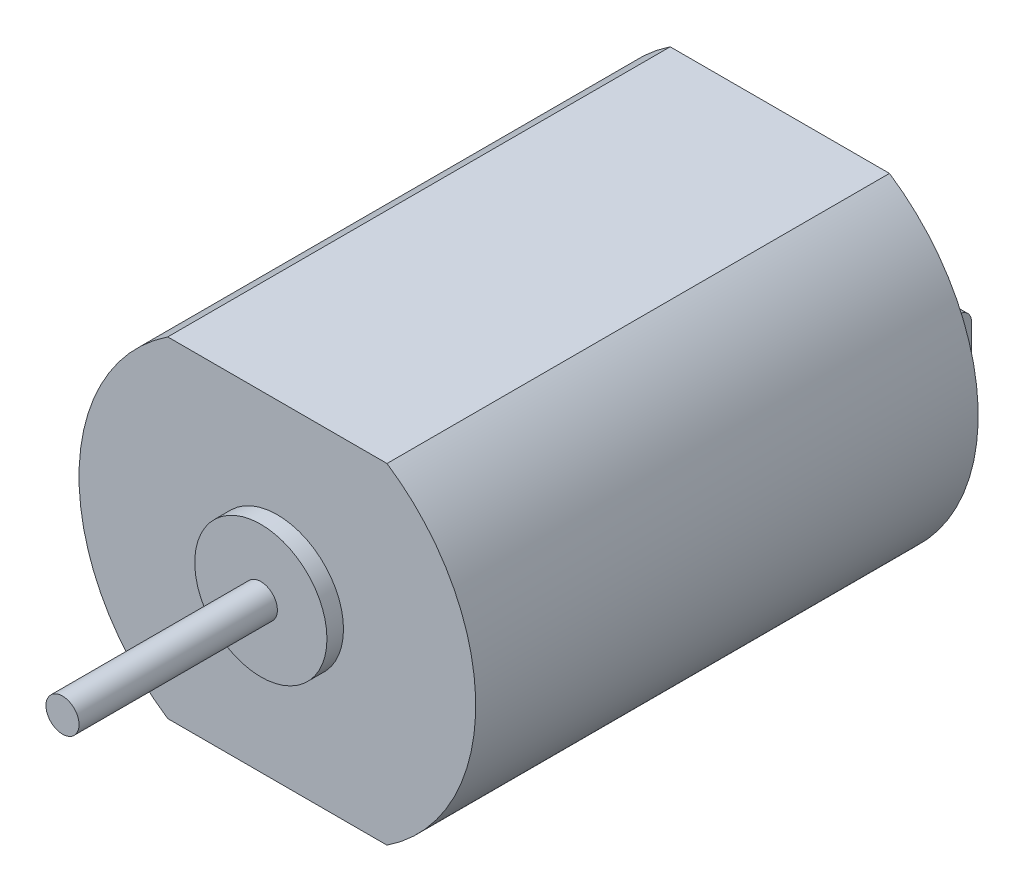
ISO-10303-21;
HEADER;
FILE_DESCRIPTION(('STEP AP214'),'2;1');
FILE_NAME('part.step','',(''),(''),'','','');
FILE_SCHEMA(('AUTOMOTIVE_DESIGN { 1 0 10303 214 1 1 1 1 }'));
ENDSEC;
DATA;
#1=APPLICATION_CONTEXT('core data for automotive mechanical design processes');
#2=APPLICATION_PROTOCOL_DEFINITION('international standard','automotive_design',2000,#1);
#3=PRODUCT_CONTEXT('',#1,'mechanical');
#4=PRODUCT('Part','Part','',(#3));
#5=PRODUCT_RELATED_PRODUCT_CATEGORY('part','',(#4));
#6=PRODUCT_DEFINITION_FORMATION('','',#4);
#7=PRODUCT_DEFINITION_CONTEXT('part definition',#1,'design');
#8=PRODUCT_DEFINITION('design','',#6,#7);
#9=PRODUCT_DEFINITION_SHAPE('','',#8);
#10=(LENGTH_UNIT() NAMED_UNIT(*) SI_UNIT(.MILLI.,.METRE.));
#11=(NAMED_UNIT(*) PLANE_ANGLE_UNIT() SI_UNIT($,.RADIAN.));
#12=(NAMED_UNIT(*) SI_UNIT($,.STERADIAN.) SOLID_ANGLE_UNIT());
#13=UNCERTAINTY_MEASURE_WITH_UNIT(LENGTH_MEASURE(1.E-05),#10,'distance_accuracy_value','');
#14=(GEOMETRIC_REPRESENTATION_CONTEXT(3) GLOBAL_UNCERTAINTY_ASSIGNED_CONTEXT((#13)) GLOBAL_UNIT_ASSIGNED_CONTEXT((#10,
#11,#12)) REPRESENTATION_CONTEXT('',''));
#15=CARTESIAN_POINT('',(0.,0.,0.));
#16=DIRECTION('',(0.,0.,1.));
#17=DIRECTION('',(1.,0.,0.));
#18=AXIS2_PLACEMENT_3D('',#15,#16,#17);
#19=CARTESIAN_POINT('',(0.,5.,15.2));
#20=DIRECTION('',(0.,1.,0.));
#21=DIRECTION('',(0.,0.,1.));
#22=AXIS2_PLACEMENT_3D('',#19,#20,#21);
#23=PLANE('',#22);
#24=DIRECTION('',(1.,0.,0.));
#25=VECTOR('',#24,1.);
#26=CARTESIAN_POINT('',(0.,5.,0.));
#27=LINE('',#26,#25);
#28=CARTESIAN_POINT('',(-3.3166247903554,5.,0.));
#29=VERTEX_POINT('',#28);
#30=CARTESIAN_POINT('',(3.3166247903554,5.,0.));
#31=VERTEX_POINT('',#30);
#32=EDGE_CURVE('E311',#29,#31,#27,.T.);
#33=ORIENTED_EDGE('',*,*,#32,.F.);
#34=DIRECTION('',(0.,0.,-1.));
#35=VECTOR('',#34,1.);
#36=CARTESIAN_POINT('',(-3.3166247903554,5.,15.2));
#37=LINE('',#36,#35);
#38=CARTESIAN_POINT('',(-3.3166247903554,5.,15.2));
#39=VERTEX_POINT('',#38);
#40=EDGE_CURVE('E340',#39,#29,#37,.T.);
#41=ORIENTED_EDGE('',*,*,#40,.F.);
#42=DIRECTION('',(1.,0.,0.));
#43=VECTOR('',#42,1.);
#44=CARTESIAN_POINT('',(0.,5.,15.2));
#45=LINE('',#44,#43);
#46=CARTESIAN_POINT('',(3.3166247903554,5.,15.2));
#47=VERTEX_POINT('',#46);
#48=EDGE_CURVE('E317',#39,#47,#45,.T.);
#49=ORIENTED_EDGE('',*,*,#48,.T.);
#50=DIRECTION('',(0.,0.,-1.));
#51=VECTOR('',#50,1.);
#52=CARTESIAN_POINT('',(3.3166247903554,5.,15.2));
#53=LINE('',#52,#51);
#54=EDGE_CURVE('E332',#47,#31,#53,.T.);
#55=ORIENTED_EDGE('',*,*,#54,.T.);
#56=EDGE_LOOP('',(#33,#41,#49,#55));
#57=FACE_BOUND('',#56,.T.);
#58=ADVANCED_FACE('F39',(#57),#23,.T.);
#59=CARTESIAN_POINT('',(0.,0.,15.2));
#60=DIRECTION('',(0.,0.,-1.));
#61=DIRECTION('',(-1.,0.,0.));
#62=AXIS2_PLACEMENT_3D('',#59,#60,#61);
#63=CYLINDRICAL_SURFACE('',#62,6.);
#64=CARTESIAN_POINT('',(0.,0.,0.));
#65=DIRECTION('',(0.,0.,1.));
#66=DIRECTION('',(1.,0.,0.));
#67=AXIS2_PLACEMENT_3D('',#64,#65,#66);
#68=CIRCLE('',#67,6.);
#69=CARTESIAN_POINT('',(-3.3166247903554,-5.,0.));
#70=VERTEX_POINT('',#69);
#71=EDGE_CURVE('E328',#29,#70,#68,.T.);
#72=ORIENTED_EDGE('',*,*,#71,.T.);
#73=DIRECTION('',(0.,0.,-1.));
#74=VECTOR('',#73,1.);
#75=CARTESIAN_POINT('',(-3.3166247903554,-5.,15.2));
#76=LINE('',#75,#74);
#77=CARTESIAN_POINT('',(-3.3166247903554,-5.,15.2));
#78=VERTEX_POINT('',#77);
#79=EDGE_CURVE('E337',#78,#70,#76,.T.);
#80=ORIENTED_EDGE('',*,*,#79,.F.);
#81=CARTESIAN_POINT('',(0.,0.,15.2));
#82=DIRECTION('',(0.,0.,1.));
#83=DIRECTION('',(1.,0.,0.));
#84=AXIS2_PLACEMENT_3D('',#81,#82,#83);
#85=CIRCLE('',#84,6.);
#86=EDGE_CURVE('E320',#39,#78,#85,.T.);
#87=ORIENTED_EDGE('',*,*,#86,.F.);
#88=ORIENTED_EDGE('',*,*,#40,.T.);
#89=EDGE_LOOP('',(#72,#80,#87,#88));
#90=FACE_BOUND('',#89,.T.);
#91=ADVANCED_FACE('F441',(#90),#63,.T.);
#92=CARTESIAN_POINT('',(0.,-5.,15.2));
#93=DIRECTION('',(0.,1.,0.));
#94=DIRECTION('',(0.,0.,1.));
#95=AXIS2_PLACEMENT_3D('',#92,#93,#94);
#96=PLANE('',#95);
#97=DIRECTION('',(1.,0.,0.));
#98=VECTOR('',#97,1.);
#99=CARTESIAN_POINT('',(0.,-5.,0.));
#100=LINE('',#99,#98);
#101=CARTESIAN_POINT('',(3.3166247903554,-5.,0.));
#102=VERTEX_POINT('',#101);
#103=EDGE_CURVE('E330',#70,#102,#100,.T.);
#104=ORIENTED_EDGE('',*,*,#103,.T.);
#105=DIRECTION('',(0.,0.,-1.));
#106=VECTOR('',#105,1.);
#107=CARTESIAN_POINT('',(3.3166247903554,-5.,15.2));
#108=LINE('',#107,#106);
#109=CARTESIAN_POINT('',(3.3166247903554,-5.,15.2));
#110=VERTEX_POINT('',#109);
#111=EDGE_CURVE('E334',#110,#102,#108,.T.);
#112=ORIENTED_EDGE('',*,*,#111,.F.);
#113=DIRECTION('',(1.,0.,0.));
#114=VECTOR('',#113,1.);
#115=CARTESIAN_POINT('',(0.,-5.,15.2));
#116=LINE('',#115,#114);
#117=EDGE_CURVE('E323',#78,#110,#116,.T.);
#118=ORIENTED_EDGE('',*,*,#117,.F.);
#119=ORIENTED_EDGE('',*,*,#79,.T.);
#120=EDGE_LOOP('',(#104,#112,#118,#119));
#121=FACE_BOUND('',#120,.T.);
#122=ADVANCED_FACE('F447',(#121),#96,.F.);
#123=EDGE_CURVE('E321',#102,#31,#68,.T.);
#124=ORIENTED_EDGE('',*,*,#123,.T.);
#125=ORIENTED_EDGE('',*,*,#54,.F.);
#126=EDGE_CURVE('E324',#110,#47,#85,.T.);
#127=ORIENTED_EDGE('',*,*,#126,.F.);
#128=ORIENTED_EDGE('',*,*,#111,.T.);
#129=EDGE_LOOP('',(#124,#125,#127,#128));
#130=FACE_BOUND('',#129,.T.);
#131=ADVANCED_FACE('F450',(#130),#63,.T.);
#132=CARTESIAN_POINT('',(0.,0.,15.2));
#133=DIRECTION('',(0.,0.,1.));
#134=DIRECTION('',(1.,0.,0.));
#135=AXIS2_PLACEMENT_3D('',#132,#133,#134);
#136=PLANE('',#135);
#137=CARTESIAN_POINT('',(0.,0.,15.2));
#138=DIRECTION('',(0.,0.,1.));
#139=DIRECTION('',(1.,0.,0.));
#140=AXIS2_PLACEMENT_3D('',#137,#138,#139);
#141=CIRCLE('',#140,2.);
#142=CARTESIAN_POINT('',(2.,0.,15.2));
#143=VERTEX_POINT('',#142);
#144=EDGE_CURVE('E11',#143,#143,#141,.T.);
#145=ORIENTED_EDGE('',*,*,#144,.F.);
#146=EDGE_LOOP('',(#145));
#147=FACE_BOUND('',#146,.T.);
#148=ORIENTED_EDGE('',*,*,#48,.F.);
#149=ORIENTED_EDGE('',*,*,#86,.T.);
#150=ORIENTED_EDGE('',*,*,#117,.T.);
#151=ORIENTED_EDGE('',*,*,#126,.T.);
#152=EDGE_LOOP('',(#148,#149,#150,#151));
#153=FACE_BOUND('',#152,.T.);
#154=ADVANCED_FACE('F501',(#147,#153),#136,.T.);
#155=CARTESIAN_POINT('',(0.,0.,0.));
#156=DIRECTION('',(0.,0.,1.));
#157=DIRECTION('',(1.,0.,0.));
#158=AXIS2_PLACEMENT_3D('',#155,#156,#157);
#159=PLANE('',#158);
#160=CARTESIAN_POINT('',(0.,0.,0.));
#161=DIRECTION('',(0.,0.,1.));
#162=DIRECTION('',(1.,0.,0.));
#163=AXIS2_PLACEMENT_3D('',#160,#161,#162);
#164=CIRCLE('',#163,2.5);
#165=CARTESIAN_POINT('',(2.5,0.,0.));
#166=VERTEX_POINT('',#165);
#167=EDGE_CURVE('E406',#166,#166,#164,.T.);
#168=ORIENTED_EDGE('',*,*,#167,.T.);
#169=EDGE_LOOP('',(#168));
#170=FACE_BOUND('',#169,.T.);
#171=DIRECTION('',(0.,1.,0.));
#172=VECTOR('',#171,1.);
#173=CARTESIAN_POINT('',(-3.8,-0.75,0.));
#174=LINE('',#173,#172);
#175=CARTESIAN_POINT('',(-3.8,-0.75,0.));
#176=VERTEX_POINT('',#175);
#177=CARTESIAN_POINT('',(-3.8,0.75,0.));
#178=VERTEX_POINT('',#177);
#179=EDGE_CURVE('E273',#176,#178,#174,.T.);
#180=ORIENTED_EDGE('',*,*,#179,.F.);
#181=DIRECTION('',(1.,0.,0.));
#182=VECTOR('',#181,1.);
#183=CARTESIAN_POINT('',(-3.8,-0.75,0.));
#184=LINE('',#183,#182);
#185=CARTESIAN_POINT('',(-3.5,-0.75,0.));
#186=VERTEX_POINT('',#185);
#187=EDGE_CURVE('E283',#176,#186,#184,.T.);
#188=ORIENTED_EDGE('',*,*,#187,.T.);
#189=DIRECTION('',(0.,1.,0.));
#190=VECTOR('',#189,1.);
#191=CARTESIAN_POINT('',(-3.5,-0.75,0.));
#192=LINE('',#191,#190);
#193=CARTESIAN_POINT('',(-3.5,0.75,0.));
#194=VERTEX_POINT('',#193);
#195=EDGE_CURVE('E280',#186,#194,#192,.T.);
#196=ORIENTED_EDGE('',*,*,#195,.T.);
#197=DIRECTION('',(1.,0.,0.));
#198=VECTOR('',#197,1.);
#199=CARTESIAN_POINT('',(-3.8,0.75,0.));
#200=LINE('',#199,#198);
#201=EDGE_CURVE('E276',#178,#194,#200,.T.);
#202=ORIENTED_EDGE('',*,*,#201,.F.);
#203=EDGE_LOOP('',(#180,#188,#196,#202));
#204=FACE_BOUND('',#203,.T.);
#205=DIRECTION('',(0.,1.,0.));
#206=VECTOR('',#205,1.);
#207=CARTESIAN_POINT('',(3.5,-0.75,0.));
#208=LINE('',#207,#206);
#209=CARTESIAN_POINT('',(3.5,-0.75,0.));
#210=VERTEX_POINT('',#209);
#211=CARTESIAN_POINT('',(3.5,0.75,0.));
#212=VERTEX_POINT('',#211);
#213=EDGE_CURVE('E295',#210,#212,#208,.T.);
#214=ORIENTED_EDGE('',*,*,#213,.F.);
#215=DIRECTION('',(1.,0.,0.));
#216=VECTOR('',#215,1.);
#217=CARTESIAN_POINT('',(3.5,-0.75,0.));
#218=LINE('',#217,#216);
#219=CARTESIAN_POINT('',(3.8,-0.75,0.));
#220=VERTEX_POINT('',#219);
#221=EDGE_CURVE('E286',#210,#220,#218,.T.);
#222=ORIENTED_EDGE('',*,*,#221,.T.);
#223=DIRECTION('',(0.,1.,0.));
#224=VECTOR('',#223,1.);
#225=CARTESIAN_POINT('',(3.8,-0.75,0.));
#226=LINE('',#225,#224);
#227=CARTESIAN_POINT('',(3.8,0.75,0.));
#228=VERTEX_POINT('',#227);
#229=EDGE_CURVE('E301',#220,#228,#226,.T.);
#230=ORIENTED_EDGE('',*,*,#229,.T.);
#231=DIRECTION('',(1.,0.,0.));
#232=VECTOR('',#231,1.);
#233=CARTESIAN_POINT('',(3.5,0.75,0.));
#234=LINE('',#233,#232);
#235=EDGE_CURVE('E304',#212,#228,#234,.T.);
#236=ORIENTED_EDGE('',*,*,#235,.F.);
#237=EDGE_LOOP('',(#214,#222,#230,#236));
#238=FACE_BOUND('',#237,.T.);
#239=ORIENTED_EDGE('',*,*,#32,.T.);
#240=ORIENTED_EDGE('',*,*,#123,.F.);
#241=ORIENTED_EDGE('',*,*,#103,.F.);
#242=ORIENTED_EDGE('',*,*,#71,.F.);
#243=EDGE_LOOP('',(#239,#240,#241,#242));
#244=FACE_BOUND('',#243,.T.);
#245=ADVANCED_FACE('F480',(#170,#204,#238,#244),#159,.F.);
#246=CARTESIAN_POINT('',(3.5,-0.75,-2.));
#247=DIRECTION('',(0.,-1.,0.));
#248=DIRECTION('',(0.,0.,-1.));
#249=AXIS2_PLACEMENT_3D('',#246,#247,#248);
#250=PLANE('',#249);
#251=DIRECTION('',(0.,0.,1.));
#252=VECTOR('',#251,1.);
#253=CARTESIAN_POINT('',(3.5,-0.75,-2.));
#254=LINE('',#253,#252);
#255=CARTESIAN_POINT('',(3.5,-0.75,-1.6));
#256=VERTEX_POINT('',#255);
#257=EDGE_CURVE('E309',#256,#210,#254,.T.);
#258=ORIENTED_EDGE('',*,*,#257,.F.);
#259=DIRECTION('',(1.,0.,0.));
#260=VECTOR('',#259,1.);
#261=CARTESIAN_POINT('',(3.8,-0.75,-1.6));
#262=LINE('',#261,#260);
#263=CARTESIAN_POINT('',(3.8,-0.75,-1.6));
#264=VERTEX_POINT('',#263);
#265=EDGE_CURVE('E382',#256,#264,#262,.T.);
#266=ORIENTED_EDGE('',*,*,#265,.T.);
#267=DIRECTION('',(0.,0.,1.));
#268=VECTOR('',#267,1.);
#269=CARTESIAN_POINT('',(3.8,-0.75,-2.));
#270=LINE('',#269,#268);
#271=EDGE_CURVE('E298',#264,#220,#270,.T.);
#272=ORIENTED_EDGE('',*,*,#271,.T.);
#273=ORIENTED_EDGE('',*,*,#221,.F.);
#274=EDGE_LOOP('',(#258,#266,#272,#273));
#275=FACE_BOUND('',#274,.T.);
#276=ADVANCED_FACE('F473',(#275),#250,.T.);
#277=CARTESIAN_POINT('',(3.5,-0.75,-2.));
#278=DIRECTION('',(1.,0.,0.));
#279=DIRECTION('',(0.,0.,-1.));
#280=AXIS2_PLACEMENT_3D('',#277,#278,#279);
#281=PLANE('',#280);
#282=DIRECTION('',(0.,0.,1.));
#283=VECTOR('',#282,1.);
#284=CARTESIAN_POINT('',(3.5,0.449999999999999,-2.));
#285=LINE('',#284,#283);
#286=CARTESIAN_POINT('',(3.5,0.45,-1.05));
#287=VERTEX_POINT('',#286);
#288=CARTESIAN_POINT('',(3.5,0.45,-0.95));
#289=VERTEX_POINT('',#288);
#290=EDGE_CURVE('E255',#287,#289,#285,.T.);
#291=ORIENTED_EDGE('',*,*,#290,.T.);
#292=CARTESIAN_POINT('',(3.5,0.,-0.95));
#293=DIRECTION('',(1.,0.,0.));
#294=DIRECTION('',(0.,0.,-1.));
#295=AXIS2_PLACEMENT_3D('',#292,#293,#294);
#296=CIRCLE('',#295,0.45);
#297=CARTESIAN_POINT('',(3.5,-0.45,-0.95));
#298=VERTEX_POINT('',#297);
#299=EDGE_CURVE('E261',#289,#298,#296,.T.);
#300=ORIENTED_EDGE('',*,*,#299,.T.);
#301=DIRECTION('',(0.,0.,-1.));
#302=VECTOR('',#301,1.);
#303=CARTESIAN_POINT('',(3.5,-0.45,-2.));
#304=LINE('',#303,#302);
#305=CARTESIAN_POINT('',(3.5,-0.45,-1.05));
#306=VERTEX_POINT('',#305);
#307=EDGE_CURVE('E246',#298,#306,#304,.T.);
#308=ORIENTED_EDGE('',*,*,#307,.T.);
#309=CARTESIAN_POINT('',(3.5,0.,-1.05));
#310=DIRECTION('',(1.,0.,0.));
#311=DIRECTION('',(0.,0.,-1.));
#312=AXIS2_PLACEMENT_3D('',#309,#310,#311);
#313=CIRCLE('',#312,0.45);
#314=EDGE_CURVE('E212',#306,#287,#313,.T.);
#315=ORIENTED_EDGE('',*,*,#314,.T.);
#316=EDGE_LOOP('',(#291,#300,#308,#315));
#317=FACE_BOUND('',#316,.T.);
#318=DIRECTION('',(0.,0.,1.));
#319=VECTOR('',#318,1.);
#320=CARTESIAN_POINT('',(3.5,0.75,-2.));
#321=LINE('',#320,#319);
#322=CARTESIAN_POINT('',(3.5,0.75,-1.6));
#323=VERTEX_POINT('',#322);
#324=EDGE_CURVE('E312',#323,#212,#321,.T.);
#325=ORIENTED_EDGE('',*,*,#324,.F.);
#326=CARTESIAN_POINT('',(3.5,0.35,-1.6));
#327=DIRECTION('',(1.,0.,0.));
#328=DIRECTION('',(0.,0.,-1.));
#329=AXIS2_PLACEMENT_3D('',#326,#327,#328);
#330=CIRCLE('',#329,0.4);
#331=CARTESIAN_POINT('',(3.5,0.35,-2.));
#332=VERTEX_POINT('',#331);
#333=EDGE_CURVE('E380',#323,#332,#330,.F.);
#334=ORIENTED_EDGE('',*,*,#333,.T.);
#335=DIRECTION('',(0.,1.,0.));
#336=VECTOR('',#335,1.);
#337=CARTESIAN_POINT('',(3.5,-0.75,-2.));
#338=LINE('',#337,#336);
#339=CARTESIAN_POINT('',(3.5,-0.35,-2.));
#340=VERTEX_POINT('',#339);
#341=EDGE_CURVE('E294',#340,#332,#338,.T.);
#342=ORIENTED_EDGE('',*,*,#341,.F.);
#343=CARTESIAN_POINT('',(3.5,-0.35,-1.6));
#344=DIRECTION('',(1.,0.,0.));
#345=DIRECTION('',(0.,0.,-1.));
#346=AXIS2_PLACEMENT_3D('',#343,#344,#345);
#347=CIRCLE('',#346,0.4);
#348=EDGE_CURVE('E56',#340,#256,#347,.F.);
#349=ORIENTED_EDGE('',*,*,#348,.T.);
#350=ORIENTED_EDGE('',*,*,#257,.T.);
#351=ORIENTED_EDGE('',*,*,#213,.T.);
#352=EDGE_LOOP('',(#325,#334,#342,#349,#350,#351));
#353=FACE_BOUND('',#352,.T.);
#354=ADVANCED_FACE('F482',(#317,#353),#281,.F.);
#355=CARTESIAN_POINT('',(3.5,0.75,-2.));
#356=DIRECTION('',(0.,-1.,0.));
#357=DIRECTION('',(0.,0.,-1.));
#358=AXIS2_PLACEMENT_3D('',#355,#356,#357);
#359=PLANE('',#358);
#360=DIRECTION('',(0.,0.,1.));
#361=VECTOR('',#360,1.);
#362=CARTESIAN_POINT('',(3.8,0.75,-2.));
#363=LINE('',#362,#361);
#364=CARTESIAN_POINT('',(3.8,0.75,-1.6));
#365=VERTEX_POINT('',#364);
#366=EDGE_CURVE('E314',#365,#228,#363,.T.);
#367=ORIENTED_EDGE('',*,*,#366,.F.);
#368=DIRECTION('',(1.,0.,0.));
#369=VECTOR('',#368,1.);
#370=CARTESIAN_POINT('',(3.5,0.75,-1.6));
#371=LINE('',#370,#369);
#372=EDGE_CURVE('E64',#365,#323,#371,.F.);
#373=ORIENTED_EDGE('',*,*,#372,.T.);
#374=ORIENTED_EDGE('',*,*,#324,.T.);
#375=ORIENTED_EDGE('',*,*,#235,.T.);
#376=EDGE_LOOP('',(#367,#373,#374,#375));
#377=FACE_BOUND('',#376,.T.);
#378=ADVANCED_FACE('F487',(#377),#359,.F.);
#379=CARTESIAN_POINT('',(3.8,-0.75,-2.));
#380=DIRECTION('',(1.,0.,0.));
#381=DIRECTION('',(0.,0.,-1.));
#382=AXIS2_PLACEMENT_3D('',#379,#380,#381);
#383=PLANE('',#382);
#384=CARTESIAN_POINT('',(3.8,0.,-0.95));
#385=DIRECTION('',(1.,0.,0.));
#386=DIRECTION('',(0.,0.,-1.));
#387=AXIS2_PLACEMENT_3D('',#384,#385,#386);
#388=CIRCLE('',#387,0.45);
#389=CARTESIAN_POINT('',(3.8,0.45,-0.95));
#390=VERTEX_POINT('',#389);
#391=CARTESIAN_POINT('',(3.8,-0.45,-0.95));
#392=VERTEX_POINT('',#391);
#393=EDGE_CURVE('E226',#390,#392,#388,.T.);
#394=ORIENTED_EDGE('',*,*,#393,.F.);
#395=DIRECTION('',(0.,0.,1.));
#396=VECTOR('',#395,1.);
#397=CARTESIAN_POINT('',(3.8,0.45,-0.95));
#398=LINE('',#397,#396);
#399=CARTESIAN_POINT('',(3.8,0.45,-1.05));
#400=VERTEX_POINT('',#399);
#401=EDGE_CURVE('E231',#400,#390,#398,.T.);
#402=ORIENTED_EDGE('',*,*,#401,.F.);
#403=CARTESIAN_POINT('',(3.8,0.,-1.05));
#404=DIRECTION('',(1.,0.,0.));
#405=DIRECTION('',(0.,0.,-1.));
#406=AXIS2_PLACEMENT_3D('',#403,#404,#405);
#407=CIRCLE('',#406,0.45);
#408=CARTESIAN_POINT('',(3.8,-0.45,-1.05));
#409=VERTEX_POINT('',#408);
#410=EDGE_CURVE('E209',#409,#400,#407,.T.);
#411=ORIENTED_EDGE('',*,*,#410,.F.);
#412=DIRECTION('',(0.,0.,-1.));
#413=VECTOR('',#412,1.);
#414=CARTESIAN_POINT('',(3.8,-0.45,-0.95));
#415=LINE('',#414,#413);
#416=EDGE_CURVE('E220',#392,#409,#415,.T.);
#417=ORIENTED_EDGE('',*,*,#416,.F.);
#418=EDGE_LOOP('',(#394,#402,#411,#417));
#419=FACE_BOUND('',#418,.T.);
#420=DIRECTION('',(0.,1.,0.));
#421=VECTOR('',#420,1.);
#422=CARTESIAN_POINT('',(3.8,-0.75,-2.));
#423=LINE('',#422,#421);
#424=CARTESIAN_POINT('',(3.8,-0.35,-2.));
#425=VERTEX_POINT('',#424);
#426=CARTESIAN_POINT('',(3.8,0.35,-2.));
#427=VERTEX_POINT('',#426);
#428=EDGE_CURVE('E291',#425,#427,#423,.T.);
#429=ORIENTED_EDGE('',*,*,#428,.T.);
#430=CARTESIAN_POINT('',(3.8,0.35,-1.6));
#431=DIRECTION('',(1.,0.,0.));
#432=DIRECTION('',(0.,0.,-1.));
#433=AXIS2_PLACEMENT_3D('',#430,#431,#432);
#434=CIRCLE('',#433,0.4);
#435=EDGE_CURVE('E376',#427,#365,#434,.T.);
#436=ORIENTED_EDGE('',*,*,#435,.T.);
#437=ORIENTED_EDGE('',*,*,#366,.T.);
#438=ORIENTED_EDGE('',*,*,#229,.F.);
#439=ORIENTED_EDGE('',*,*,#271,.F.);
#440=CARTESIAN_POINT('',(3.8,-0.35,-1.6));
#441=DIRECTION('',(1.,0.,0.));
#442=DIRECTION('',(0.,0.,-1.));
#443=AXIS2_PLACEMENT_3D('',#440,#441,#442);
#444=CIRCLE('',#443,0.4);
#445=EDGE_CURVE('E374',#264,#425,#444,.T.);
#446=ORIENTED_EDGE('',*,*,#445,.T.);
#447=EDGE_LOOP('',(#429,#436,#437,#438,#439,#446));
#448=FACE_BOUND('',#447,.T.);
#449=ADVANCED_FACE('F228',(#419,#448),#383,.T.);
#450=CARTESIAN_POINT('',(0.,0.,-2.));
#451=DIRECTION('',(0.,0.,1.));
#452=DIRECTION('',(1.,0.,0.));
#453=AXIS2_PLACEMENT_3D('',#450,#451,#452);
#454=PLANE('',#453);
#455=ORIENTED_EDGE('',*,*,#341,.T.);
#456=DIRECTION('',(1.,0.,0.));
#457=VECTOR('',#456,1.);
#458=CARTESIAN_POINT('',(0.,0.35,-2.));
#459=LINE('',#458,#457);
#460=EDGE_CURVE('E371',#332,#427,#459,.T.);
#461=ORIENTED_EDGE('',*,*,#460,.T.);
#462=ORIENTED_EDGE('',*,*,#428,.F.);
#463=DIRECTION('',(1.,0.,0.));
#464=VECTOR('',#463,1.);
#465=CARTESIAN_POINT('',(3.5,-0.35,-2.));
#466=LINE('',#465,#464);
#467=EDGE_CURVE('E369',#425,#340,#466,.F.);
#468=ORIENTED_EDGE('',*,*,#467,.T.);
#469=EDGE_LOOP('',(#455,#461,#462,#468));
#470=FACE_BOUND('',#469,.T.);
#471=ADVANCED_FACE('F486',(#470),#454,.F.);
#472=CARTESIAN_POINT('',(-3.8,-0.75,-2.));
#473=DIRECTION('',(0.,-1.,0.));
#474=DIRECTION('',(0.,0.,-1.));
#475=AXIS2_PLACEMENT_3D('',#472,#473,#474);
#476=PLANE('',#475);
#477=DIRECTION('',(0.,0.,1.));
#478=VECTOR('',#477,1.);
#479=CARTESIAN_POINT('',(-3.8,-0.75,-2.));
#480=LINE('',#479,#478);
#481=CARTESIAN_POINT('',(-3.8,-0.75,-1.6));
#482=VERTEX_POINT('',#481);
#483=EDGE_CURVE('E264',#482,#176,#480,.T.);
#484=ORIENTED_EDGE('',*,*,#483,.F.);
#485=DIRECTION('',(1.,0.,0.));
#486=VECTOR('',#485,1.);
#487=CARTESIAN_POINT('',(-3.5,-0.75,-1.6));
#488=LINE('',#487,#486);
#489=CARTESIAN_POINT('',(-3.5,-0.75,-1.6));
#490=VERTEX_POINT('',#489);
#491=EDGE_CURVE('E366',#482,#490,#488,.T.);
#492=ORIENTED_EDGE('',*,*,#491,.T.);
#493=DIRECTION('',(0.,0.,1.));
#494=VECTOR('',#493,1.);
#495=CARTESIAN_POINT('',(-3.5,-0.75,-2.));
#496=LINE('',#495,#494);
#497=EDGE_CURVE('E265',#490,#186,#496,.T.);
#498=ORIENTED_EDGE('',*,*,#497,.T.);
#499=ORIENTED_EDGE('',*,*,#187,.F.);
#500=EDGE_LOOP('',(#484,#492,#498,#499));
#501=FACE_BOUND('',#500,.T.);
#502=ADVANCED_FACE('F584',(#501),#476,.T.);
#503=CARTESIAN_POINT('',(-3.8,-0.75,-2.));
#504=DIRECTION('',(1.,0.,0.));
#505=DIRECTION('',(0.,0.,-1.));
#506=AXIS2_PLACEMENT_3D('',#503,#504,#505);
#507=PLANE('',#506);
#508=DIRECTION('',(0.,0.,1.));
#509=VECTOR('',#508,1.);
#510=CARTESIAN_POINT('',(-3.8,0.449999999999999,-2.));
#511=LINE('',#510,#509);
#512=CARTESIAN_POINT('',(-3.8,0.45,-1.05));
#513=VERTEX_POINT('',#512);
#514=CARTESIAN_POINT('',(-3.8,0.45,-0.95));
#515=VERTEX_POINT('',#514);
#516=EDGE_CURVE('E252',#513,#515,#511,.T.);
#517=ORIENTED_EDGE('',*,*,#516,.T.);
#518=CARTESIAN_POINT('',(-3.8,0.,-0.95));
#519=DIRECTION('',(1.,0.,0.));
#520=DIRECTION('',(0.,0.,-1.));
#521=AXIS2_PLACEMENT_3D('',#518,#519,#520);
#522=CIRCLE('',#521,0.45);
#523=CARTESIAN_POINT('',(-3.8,-0.45,-0.95));
#524=VERTEX_POINT('',#523);
#525=EDGE_CURVE('E258',#515,#524,#522,.T.);
#526=ORIENTED_EDGE('',*,*,#525,.T.);
#527=DIRECTION('',(0.,0.,-1.));
#528=VECTOR('',#527,1.);
#529=CARTESIAN_POINT('',(-3.8,-0.45,-2.));
#530=LINE('',#529,#528);
#531=CARTESIAN_POINT('',(-3.8,-0.45,-1.05));
#532=VERTEX_POINT('',#531);
#533=EDGE_CURVE('E243',#524,#532,#530,.T.);
#534=ORIENTED_EDGE('',*,*,#533,.T.);
#535=CARTESIAN_POINT('',(-3.8,0.,-1.05));
#536=DIRECTION('',(1.,0.,0.));
#537=DIRECTION('',(0.,0.,-1.));
#538=AXIS2_PLACEMENT_3D('',#535,#536,#537);
#539=CIRCLE('',#538,0.45);
#540=EDGE_CURVE('E248',#532,#513,#539,.T.);
#541=ORIENTED_EDGE('',*,*,#540,.T.);
#542=EDGE_LOOP('',(#517,#526,#534,#541));
#543=FACE_BOUND('',#542,.T.);
#544=DIRECTION('',(0.,0.,1.));
#545=VECTOR('',#544,1.);
#546=CARTESIAN_POINT('',(-3.8,0.75,-2.));
#547=LINE('',#546,#545);
#548=CARTESIAN_POINT('',(-3.8,0.75,-1.6));
#549=VERTEX_POINT('',#548);
#550=EDGE_CURVE('E270',#549,#178,#547,.T.);
#551=ORIENTED_EDGE('',*,*,#550,.F.);
#552=CARTESIAN_POINT('',(-3.8,0.35,-1.6));
#553=DIRECTION('',(1.,0.,0.));
#554=DIRECTION('',(0.,0.,-1.));
#555=AXIS2_PLACEMENT_3D('',#552,#553,#554);
#556=CIRCLE('',#555,0.4);
#557=CARTESIAN_POINT('',(-3.8,0.35,-2.));
#558=VERTEX_POINT('',#557);
#559=EDGE_CURVE('E364',#549,#558,#556,.F.);
#560=ORIENTED_EDGE('',*,*,#559,.T.);
#561=DIRECTION('',(0.,1.,0.));
#562=VECTOR('',#561,1.);
#563=CARTESIAN_POINT('',(-3.8,-0.75,-2.));
#564=LINE('',#563,#562);
#565=CARTESIAN_POINT('',(-3.8,-0.35,-2.));
#566=VERTEX_POINT('',#565);
#567=EDGE_CURVE('E267',#566,#558,#564,.T.);
#568=ORIENTED_EDGE('',*,*,#567,.F.);
#569=CARTESIAN_POINT('',(-3.8,-0.35,-1.6));
#570=DIRECTION('',(1.,0.,0.));
#571=DIRECTION('',(0.,0.,-1.));
#572=AXIS2_PLACEMENT_3D('',#569,#570,#571);
#573=CIRCLE('',#572,0.4);
#574=EDGE_CURVE('E362',#566,#482,#573,.F.);
#575=ORIENTED_EDGE('',*,*,#574,.T.);
#576=ORIENTED_EDGE('',*,*,#483,.T.);
#577=ORIENTED_EDGE('',*,*,#179,.T.);
#578=EDGE_LOOP('',(#551,#560,#568,#575,#576,#577));
#579=FACE_BOUND('',#578,.T.);
#580=ADVANCED_FACE('F591',(#543,#579),#507,.F.);
#581=CARTESIAN_POINT('',(-3.8,0.75,-2.));
#582=DIRECTION('',(0.,-1.,0.));
#583=DIRECTION('',(0.,0.,-1.));
#584=AXIS2_PLACEMENT_3D('',#581,#582,#583);
#585=PLANE('',#584);
#586=DIRECTION('',(0.,0.,1.));
#587=VECTOR('',#586,1.);
#588=CARTESIAN_POINT('',(-3.5,0.75,-2.));
#589=LINE('',#588,#587);
#590=CARTESIAN_POINT('',(-3.5,0.75,-1.6));
#591=VERTEX_POINT('',#590);
#592=EDGE_CURVE('E268',#591,#194,#589,.T.);
#593=ORIENTED_EDGE('',*,*,#592,.F.);
#594=DIRECTION('',(1.,0.,0.));
#595=VECTOR('',#594,1.);
#596=CARTESIAN_POINT('',(-3.8,0.75,-1.6));
#597=LINE('',#596,#595);
#598=EDGE_CURVE('E360',#591,#549,#597,.F.);
#599=ORIENTED_EDGE('',*,*,#598,.T.);
#600=ORIENTED_EDGE('',*,*,#550,.T.);
#601=ORIENTED_EDGE('',*,*,#201,.T.);
#602=EDGE_LOOP('',(#593,#599,#600,#601));
#603=FACE_BOUND('',#602,.T.);
#604=ADVANCED_FACE('F600',(#603),#585,.F.);
#605=CARTESIAN_POINT('',(-3.5,-0.75,-2.));
#606=DIRECTION('',(1.,0.,0.));
#607=DIRECTION('',(0.,0.,-1.));
#608=AXIS2_PLACEMENT_3D('',#605,#606,#607);
#609=PLANE('',#608);
#610=CARTESIAN_POINT('',(-3.5,0.,-0.95));
#611=DIRECTION('',(1.,0.,0.));
#612=DIRECTION('',(0.,0.,-1.));
#613=AXIS2_PLACEMENT_3D('',#610,#611,#612);
#614=CIRCLE('',#613,0.45);
#615=CARTESIAN_POINT('',(-3.5,0.45,-0.95));
#616=VERTEX_POINT('',#615);
#617=CARTESIAN_POINT('',(-3.5,-0.45,-0.95));
#618=VERTEX_POINT('',#617);
#619=EDGE_CURVE('E348',#616,#618,#614,.T.);
#620=ORIENTED_EDGE('',*,*,#619,.F.);
#621=DIRECTION('',(0.,0.,1.));
#622=VECTOR('',#621,1.);
#623=CARTESIAN_POINT('',(-3.5,0.449999999999999,-2.));
#624=LINE('',#623,#622);
#625=CARTESIAN_POINT('',(-3.5,0.45,-1.05));
#626=VERTEX_POINT('',#625);
#627=EDGE_CURVE('E346',#626,#616,#624,.T.);
#628=ORIENTED_EDGE('',*,*,#627,.F.);
#629=CARTESIAN_POINT('',(-3.5,0.,-1.05));
#630=DIRECTION('',(1.,0.,0.));
#631=DIRECTION('',(0.,0.,-1.));
#632=AXIS2_PLACEMENT_3D('',#629,#630,#631);
#633=CIRCLE('',#632,0.45);
#634=CARTESIAN_POINT('',(-3.5,-0.45,-1.05));
#635=VERTEX_POINT('',#634);
#636=EDGE_CURVE('E344',#635,#626,#633,.T.);
#637=ORIENTED_EDGE('',*,*,#636,.F.);
#638=DIRECTION('',(0.,0.,-1.));
#639=VECTOR('',#638,1.);
#640=CARTESIAN_POINT('',(-3.5,-0.45,-2.));
#641=LINE('',#640,#639);
#642=EDGE_CURVE('E342',#618,#635,#641,.T.);
#643=ORIENTED_EDGE('',*,*,#642,.F.);
#644=EDGE_LOOP('',(#620,#628,#637,#643));
#645=FACE_BOUND('',#644,.T.);
#646=DIRECTION('',(0.,1.,0.));
#647=VECTOR('',#646,1.);
#648=CARTESIAN_POINT('',(-3.5,-0.75,-2.));
#649=LINE('',#648,#647);
#650=CARTESIAN_POINT('',(-3.5,-0.35,-2.));
#651=VERTEX_POINT('',#650);
#652=CARTESIAN_POINT('',(-3.5,0.35,-2.));
#653=VERTEX_POINT('',#652);
#654=EDGE_CURVE('E277',#651,#653,#649,.T.);
#655=ORIENTED_EDGE('',*,*,#654,.T.);
#656=CARTESIAN_POINT('',(-3.5,0.35,-1.6));
#657=DIRECTION('',(1.,0.,0.));
#658=DIRECTION('',(0.,0.,-1.));
#659=AXIS2_PLACEMENT_3D('',#656,#657,#658);
#660=CIRCLE('',#659,0.4);
#661=EDGE_CURVE('E358',#653,#591,#660,.T.);
#662=ORIENTED_EDGE('',*,*,#661,.T.);
#663=ORIENTED_EDGE('',*,*,#592,.T.);
#664=ORIENTED_EDGE('',*,*,#195,.F.);
#665=ORIENTED_EDGE('',*,*,#497,.F.);
#666=CARTESIAN_POINT('',(-3.5,-0.35,-1.6));
#667=DIRECTION('',(1.,0.,0.));
#668=DIRECTION('',(0.,0.,-1.));
#669=AXIS2_PLACEMENT_3D('',#666,#667,#668);
#670=CIRCLE('',#669,0.4);
#671=EDGE_CURVE('E356',#490,#651,#670,.T.);
#672=ORIENTED_EDGE('',*,*,#671,.T.);
#673=EDGE_LOOP('',(#655,#662,#663,#664,#665,#672));
#674=FACE_BOUND('',#673,.T.);
#675=ADVANCED_FACE('F609',(#645,#674),#609,.T.);
#676=CARTESIAN_POINT('',(0.,0.,-2.));
#677=DIRECTION('',(0.,0.,1.));
#678=DIRECTION('',(1.,0.,0.));
#679=AXIS2_PLACEMENT_3D('',#676,#677,#678);
#680=PLANE('',#679);
#681=ORIENTED_EDGE('',*,*,#567,.T.);
#682=DIRECTION('',(1.,0.,0.));
#683=VECTOR('',#682,1.);
#684=CARTESIAN_POINT('',(0.,0.35,-2.));
#685=LINE('',#684,#683);
#686=EDGE_CURVE('E353',#558,#653,#685,.T.);
#687=ORIENTED_EDGE('',*,*,#686,.T.);
#688=ORIENTED_EDGE('',*,*,#654,.F.);
#689=DIRECTION('',(1.,0.,0.));
#690=VECTOR('',#689,1.);
#691=CARTESIAN_POINT('',(-3.8,-0.35,-2.));
#692=LINE('',#691,#690);
#693=EDGE_CURVE('E351',#651,#566,#692,.F.);
#694=ORIENTED_EDGE('',*,*,#693,.T.);
#695=EDGE_LOOP('',(#681,#687,#688,#694));
#696=FACE_BOUND('',#695,.T.);
#697=ADVANCED_FACE('F618',(#696),#680,.F.);
#698=CARTESIAN_POINT('',(-6.,-0.45,-0.95));
#699=DIRECTION('',(0.,-1.,0.));
#700=DIRECTION('',(0.,0.,-1.));
#701=AXIS2_PLACEMENT_3D('',#698,#699,#700);
#702=PLANE('',#701);
#703=DIRECTION('',(1.,0.,0.));
#704=VECTOR('',#703,1.);
#705=CARTESIAN_POINT('',(-6.,-0.45,-0.95));
#706=LINE('',#705,#704);
#707=EDGE_CURVE('E216',#524,#618,#706,.T.);
#708=ORIENTED_EDGE('',*,*,#707,.T.);
#709=ORIENTED_EDGE('',*,*,#642,.T.);
#710=DIRECTION('',(1.,0.,0.));
#711=VECTOR('',#710,1.);
#712=CARTESIAN_POINT('',(-6.,-0.45,-1.05));
#713=LINE('',#712,#711);
#714=EDGE_CURVE('E215',#532,#635,#713,.T.);
#715=ORIENTED_EDGE('',*,*,#714,.F.);
#716=ORIENTED_EDGE('',*,*,#533,.F.);
#717=EDGE_LOOP('',(#708,#709,#715,#716));
#718=FACE_BOUND('',#717,.T.);
#719=ADVANCED_FACE('F627',(#718),#702,.F.);
#720=CARTESIAN_POINT('',(-6.,0.,-1.05));
#721=DIRECTION('',(1.,0.,0.));
#722=DIRECTION('',(0.,0.,-1.));
#723=AXIS2_PLACEMENT_3D('',#720,#721,#722);
#724=CYLINDRICAL_SURFACE('',#723,0.45);
#725=ORIENTED_EDGE('',*,*,#714,.T.);
#726=ORIENTED_EDGE('',*,*,#636,.T.);
#727=DIRECTION('',(1.,0.,0.));
#728=VECTOR('',#727,1.);
#729=CARTESIAN_POINT('',(-6.,0.45,-1.05));
#730=LINE('',#729,#728);
#731=EDGE_CURVE('E239',#513,#626,#730,.T.);
#732=ORIENTED_EDGE('',*,*,#731,.F.);
#733=ORIENTED_EDGE('',*,*,#540,.F.);
#734=EDGE_LOOP('',(#725,#726,#732,#733));
#735=FACE_BOUND('',#734,.T.);
#736=ADVANCED_FACE('F636',(#735),#724,.F.);
#737=CARTESIAN_POINT('',(-6.,0.45,-0.95));
#738=DIRECTION('',(0.,1.,0.));
#739=DIRECTION('',(0.,0.,1.));
#740=AXIS2_PLACEMENT_3D('',#737,#738,#739);
#741=PLANE('',#740);
#742=ORIENTED_EDGE('',*,*,#731,.T.);
#743=ORIENTED_EDGE('',*,*,#627,.T.);
#744=DIRECTION('',(1.,0.,0.));
#745=VECTOR('',#744,1.);
#746=CARTESIAN_POINT('',(-6.,0.45,-0.95));
#747=LINE('',#746,#745);
#748=EDGE_CURVE('E238',#515,#616,#747,.T.);
#749=ORIENTED_EDGE('',*,*,#748,.F.);
#750=ORIENTED_EDGE('',*,*,#516,.F.);
#751=EDGE_LOOP('',(#742,#743,#749,#750));
#752=FACE_BOUND('',#751,.T.);
#753=ADVANCED_FACE('F645',(#752),#741,.F.);
#754=CARTESIAN_POINT('',(-6.,0.,-0.95));
#755=DIRECTION('',(1.,0.,0.));
#756=DIRECTION('',(0.,0.,-1.));
#757=AXIS2_PLACEMENT_3D('',#754,#755,#756);
#758=CYLINDRICAL_SURFACE('',#757,0.45);
#759=ORIENTED_EDGE('',*,*,#748,.T.);
#760=ORIENTED_EDGE('',*,*,#619,.T.);
#761=ORIENTED_EDGE('',*,*,#707,.F.);
#762=ORIENTED_EDGE('',*,*,#525,.F.);
#763=EDGE_LOOP('',(#759,#760,#761,#762));
#764=FACE_BOUND('',#763,.T.);
#765=ADVANCED_FACE('F654',(#764),#758,.F.);
#766=EDGE_CURVE('E236',#289,#390,#747,.T.);
#767=ORIENTED_EDGE('',*,*,#766,.T.);
#768=ORIENTED_EDGE('',*,*,#393,.T.);
#769=EDGE_CURVE('E223',#298,#392,#706,.T.);
#770=ORIENTED_EDGE('',*,*,#769,.F.);
#771=ORIENTED_EDGE('',*,*,#299,.F.);
#772=EDGE_LOOP('',(#767,#768,#770,#771));
#773=FACE_BOUND('',#772,.T.);
#774=ADVANCED_FACE('F664',(#773),#758,.F.);
#775=EDGE_CURVE('E240',#287,#400,#730,.T.);
#776=ORIENTED_EDGE('',*,*,#775,.T.);
#777=ORIENTED_EDGE('',*,*,#401,.T.);
#778=ORIENTED_EDGE('',*,*,#766,.F.);
#779=ORIENTED_EDGE('',*,*,#290,.F.);
#780=EDGE_LOOP('',(#776,#777,#778,#779));
#781=FACE_BOUND('',#780,.T.);
#782=ADVANCED_FACE('F657',(#781),#741,.F.);
#783=EDGE_CURVE('E204',#306,#409,#713,.T.);
#784=ORIENTED_EDGE('',*,*,#783,.T.);
#785=ORIENTED_EDGE('',*,*,#410,.T.);
#786=ORIENTED_EDGE('',*,*,#775,.F.);
#787=ORIENTED_EDGE('',*,*,#314,.F.);
#788=EDGE_LOOP('',(#784,#785,#786,#787));
#789=FACE_BOUND('',#788,.T.);
#790=ADVANCED_FACE('F206',(#789),#724,.F.);
#791=ORIENTED_EDGE('',*,*,#769,.T.);
#792=ORIENTED_EDGE('',*,*,#416,.T.);
#793=ORIENTED_EDGE('',*,*,#783,.F.);
#794=ORIENTED_EDGE('',*,*,#307,.F.);
#795=EDGE_LOOP('',(#791,#792,#793,#794));
#796=FACE_BOUND('',#795,.T.);
#797=ADVANCED_FACE('F221',(#796),#702,.F.);
#798=CARTESIAN_POINT('',(0.,0.35,-1.6));
#799=DIRECTION('',(1.,0.,0.));
#800=DIRECTION('',(0.,0.,-1.));
#801=AXIS2_PLACEMENT_3D('',#798,#799,#800);
#802=CYLINDRICAL_SURFACE('',#801,0.4);
#803=ORIENTED_EDGE('',*,*,#559,.F.);
#804=ORIENTED_EDGE('',*,*,#598,.F.);
#805=ORIENTED_EDGE('',*,*,#661,.F.);
#806=ORIENTED_EDGE('',*,*,#686,.F.);
#807=EDGE_LOOP('',(#803,#804,#805,#806));
#808=FACE_BOUND('',#807,.T.);
#809=ADVANCED_FACE('F454',(#808),#802,.T.);
#810=CARTESIAN_POINT('',(-3.8,-0.35,-1.6));
#811=DIRECTION('',(-1.,0.,0.));
#812=DIRECTION('',(0.,0.,1.));
#813=AXIS2_PLACEMENT_3D('',#810,#811,#812);
#814=CYLINDRICAL_SURFACE('',#813,0.4);
#815=ORIENTED_EDGE('',*,*,#574,.F.);
#816=ORIENTED_EDGE('',*,*,#693,.F.);
#817=ORIENTED_EDGE('',*,*,#671,.F.);
#818=ORIENTED_EDGE('',*,*,#491,.F.);
#819=EDGE_LOOP('',(#815,#816,#817,#818));
#820=FACE_BOUND('',#819,.T.);
#821=ADVANCED_FACE('F457',(#820),#814,.T.);
#822=CARTESIAN_POINT('',(0.,0.35,-1.6));
#823=DIRECTION('',(1.,0.,0.));
#824=DIRECTION('',(0.,0.,-1.));
#825=AXIS2_PLACEMENT_3D('',#822,#823,#824);
#826=CYLINDRICAL_SURFACE('',#825,0.4);
#827=ORIENTED_EDGE('',*,*,#333,.F.);
#828=ORIENTED_EDGE('',*,*,#372,.F.);
#829=ORIENTED_EDGE('',*,*,#435,.F.);
#830=ORIENTED_EDGE('',*,*,#460,.F.);
#831=EDGE_LOOP('',(#827,#828,#829,#830));
#832=FACE_BOUND('',#831,.T.);
#833=ADVANCED_FACE('F461',(#832),#826,.T.);
#834=CARTESIAN_POINT('',(3.5,-0.35,-1.6));
#835=DIRECTION('',(-1.,0.,0.));
#836=DIRECTION('',(0.,0.,1.));
#837=AXIS2_PLACEMENT_3D('',#834,#835,#836);
#838=CYLINDRICAL_SURFACE('',#837,0.4);
#839=ORIENTED_EDGE('',*,*,#348,.F.);
#840=ORIENTED_EDGE('',*,*,#467,.F.);
#841=ORIENTED_EDGE('',*,*,#445,.F.);
#842=ORIENTED_EDGE('',*,*,#265,.F.);
#843=EDGE_LOOP('',(#839,#840,#841,#842));
#844=FACE_BOUND('',#843,.T.);
#845=ADVANCED_FACE('F402',(#844),#838,.T.);
#846=CARTESIAN_POINT('',(0.,0.,-1.2));
#847=DIRECTION('',(0.,0.,1.));
#848=DIRECTION('',(1.,0.,0.));
#849=AXIS2_PLACEMENT_3D('',#846,#847,#848);
#850=CYLINDRICAL_SURFACE('',#849,2.5);
#851=CARTESIAN_POINT('',(0.,0.,-0.8));
#852=DIRECTION('',(0.,0.,1.));
#853=DIRECTION('',(1.,0.,0.));
#854=AXIS2_PLACEMENT_3D('',#851,#852,#853);
#855=CIRCLE('',#854,2.5);
#856=CARTESIAN_POINT('',(2.5,0.,-0.8));
#857=VERTEX_POINT('',#856);
#858=EDGE_CURVE('E385',#857,#857,#855,.T.);
#859=ORIENTED_EDGE('',*,*,#858,.T.);
#860=EDGE_LOOP('',(#859));
#861=FACE_BOUND('',#860,.T.);
#862=ORIENTED_EDGE('',*,*,#167,.F.);
#863=EDGE_LOOP('',(#862));
#864=FACE_BOUND('',#863,.T.);
#865=ADVANCED_FACE('F399',(#861,#864),#850,.T.);
#866=CARTESIAN_POINT('',(0.,0.,-1.2));
#867=DIRECTION('',(0.,0.,1.));
#868=DIRECTION('',(1.,0.,0.));
#869=AXIS2_PLACEMENT_3D('',#866,#867,#868);
#870=PLANE('',#869);
#871=CARTESIAN_POINT('',(0.,0.,-1.2));
#872=DIRECTION('',(0.,0.,1.));
#873=DIRECTION('',(1.,0.,0.));
#874=AXIS2_PLACEMENT_3D('',#871,#872,#873);
#875=CIRCLE('',#874,2.1);
#876=CARTESIAN_POINT('',(2.1,0.,-1.2));
#877=VERTEX_POINT('',#876);
#878=EDGE_CURVE('E48',#877,#877,#875,.F.);
#879=ORIENTED_EDGE('',*,*,#878,.T.);
#880=EDGE_LOOP('',(#879));
#881=FACE_BOUND('',#880,.T.);
#882=CARTESIAN_POINT('',(0.,0.,-1.2));
#883=DIRECTION('',(0.,0.,1.));
#884=DIRECTION('',(1.,0.,0.));
#885=AXIS2_PLACEMENT_3D('',#882,#883,#884);
#886=CIRCLE('',#885,1.5);
#887=CARTESIAN_POINT('',(1.5,0.,-1.2));
#888=VERTEX_POINT('',#887);
#889=EDGE_CURVE('E411',#888,#888,#886,.T.);
#890=ORIENTED_EDGE('',*,*,#889,.T.);
#891=EDGE_LOOP('',(#890));
#892=FACE_BOUND('',#891,.T.);
#893=ADVANCED_FACE('F390',(#881,#892),#870,.F.);
#894=CARTESIAN_POINT('',(0.,0.,-0.6));
#895=DIRECTION('',(0.,0.,-1.));
#896=DIRECTION('',(-1.,0.,0.));
#897=AXIS2_PLACEMENT_3D('',#894,#895,#896);
#898=CYLINDRICAL_SURFACE('',#897,1.5);
#899=CARTESIAN_POINT('',(0.,0.,-0.6));
#900=DIRECTION('',(0.,0.,1.));
#901=DIRECTION('',(1.,0.,0.));
#902=AXIS2_PLACEMENT_3D('',#899,#900,#901);
#903=CIRCLE('',#902,1.5);
#904=CARTESIAN_POINT('',(1.5,0.,-0.6));
#905=VERTEX_POINT('',#904);
#906=EDGE_CURVE('E408',#905,#905,#903,.T.);
#907=ORIENTED_EDGE('',*,*,#906,.T.);
#908=EDGE_LOOP('',(#907));
#909=FACE_BOUND('',#908,.T.);
#910=ORIENTED_EDGE('',*,*,#889,.F.);
#911=EDGE_LOOP('',(#910));
#912=FACE_BOUND('',#911,.T.);
#913=ADVANCED_FACE('F722',(#909,#912),#898,.F.);
#914=CARTESIAN_POINT('',(0.,0.,-0.6));
#915=DIRECTION('',(0.,0.,1.));
#916=DIRECTION('',(1.,0.,0.));
#917=AXIS2_PLACEMENT_3D('',#914,#915,#916);
#918=PLANE('',#917);
#919=ORIENTED_EDGE('',*,*,#906,.F.);
#920=EDGE_LOOP('',(#919));
#921=FACE_BOUND('',#920,.T.);
#922=ADVANCED_FACE('F396',(#921),#918,.F.);
#923=CARTESIAN_POINT('',(0.,0.,-0.8));
#924=DIRECTION('',(0.,0.,1.));
#925=DIRECTION('',(1.,0.,0.));
#926=AXIS2_PLACEMENT_3D('',#923,#924,#925);
#927=TOROIDAL_SURFACE('',#926,2.1,0.4);
#928=ORIENTED_EDGE('',*,*,#878,.F.);
#929=EDGE_LOOP('',(#928));
#930=FACE_BOUND('',#929,.T.);
#931=ORIENTED_EDGE('',*,*,#858,.F.);
#932=EDGE_LOOP('',(#931));
#933=FACE_BOUND('',#932,.T.);
#934=ADVANCED_FACE('F41',(#930,#933),#927,.T.);
#935=CARTESIAN_POINT('',(0.,0.,15.7));
#936=DIRECTION('',(0.,0.,-1.));
#937=DIRECTION('',(-1.,0.,0.));
#938=AXIS2_PLACEMENT_3D('',#935,#936,#937);
#939=CYLINDRICAL_SURFACE('',#938,2.);
#940=CARTESIAN_POINT('',(0.,0.,15.7));
#941=DIRECTION('',(0.,0.,1.));
#942=DIRECTION('',(1.,0.,0.));
#943=AXIS2_PLACEMENT_3D('',#940,#941,#942);
#944=CIRCLE('',#943,2.);
#945=CARTESIAN_POINT('',(2.,0.,15.7));
#946=VERTEX_POINT('',#945);
#947=EDGE_CURVE('E415',#946,#946,#944,.T.);
#948=ORIENTED_EDGE('',*,*,#947,.F.);
#949=EDGE_LOOP('',(#948));
#950=FACE_BOUND('',#949,.T.);
#951=ORIENTED_EDGE('',*,*,#144,.T.);
#952=EDGE_LOOP('',(#951));
#953=FACE_BOUND('',#952,.T.);
#954=ADVANCED_FACE('F395',(#950,#953),#939,.T.);
#955=CARTESIAN_POINT('',(0.,0.,15.7));
#956=DIRECTION('',(0.,0.,1.));
#957=DIRECTION('',(1.,0.,0.));
#958=AXIS2_PLACEMENT_3D('',#955,#956,#957);
#959=PLANE('',#958);
#960=CARTESIAN_POINT('',(0.,0.,15.7));
#961=DIRECTION('',(0.,0.,1.));
#962=DIRECTION('',(1.,0.,0.));
#963=AXIS2_PLACEMENT_3D('',#960,#961,#962);
#964=CIRCLE('',#963,0.5);
#965=CARTESIAN_POINT('',(0.5,0.,15.7));
#966=VERTEX_POINT('',#965);
#967=EDGE_CURVE('E43',#966,#966,#964,.F.);
#968=ORIENTED_EDGE('',*,*,#967,.T.);
#969=EDGE_LOOP('',(#968));
#970=FACE_BOUND('',#969,.T.);
#971=ORIENTED_EDGE('',*,*,#947,.T.);
#972=EDGE_LOOP('',(#971));
#973=FACE_BOUND('',#972,.T.);
#974=ADVANCED_FACE('F426',(#970,#973),#959,.T.);
#975=CARTESIAN_POINT('',(0.,0.,21.7));
#976=DIRECTION('',(0.,0.,-1.));
#977=DIRECTION('',(-1.,0.,0.));
#978=AXIS2_PLACEMENT_3D('',#975,#976,#977);
#979=CYLINDRICAL_SURFACE('',#978,0.5);
#980=ORIENTED_EDGE('',*,*,#967,.F.);
#981=EDGE_LOOP('',(#980));
#982=FACE_BOUND('',#981,.T.);
#983=CARTESIAN_POINT('',(0.,0.,21.7));
#984=DIRECTION('',(0.,0.,1.));
#985=DIRECTION('',(1.,0.,0.));
#986=AXIS2_PLACEMENT_3D('',#983,#984,#985);
#987=CIRCLE('',#986,0.5);
#988=CARTESIAN_POINT('',(0.5,0.,21.7));
#989=VERTEX_POINT('',#988);
#990=EDGE_CURVE('E419',#989,#989,#987,.T.);
#991=ORIENTED_EDGE('',*,*,#990,.F.);
#992=EDGE_LOOP('',(#991));
#993=FACE_BOUND('',#992,.T.);
#994=ADVANCED_FACE('F429',(#982,#993),#979,.T.);
#995=CARTESIAN_POINT('',(0.,0.,21.7));
#996=DIRECTION('',(0.,0.,1.));
#997=DIRECTION('',(1.,0.,0.));
#998=AXIS2_PLACEMENT_3D('',#995,#996,#997);
#999=PLANE('',#998);
#1000=ORIENTED_EDGE('',*,*,#990,.T.);
#1001=EDGE_LOOP('',(#1000));
#1002=FACE_BOUND('',#1001,.T.);
#1003=ADVANCED_FACE('F432',(#1002),#999,.T.);
#1004=CLOSED_SHELL('',(#58,#91,#122,#131,#154,#245,#276,#354,#378,#449,#471,#502,#580,#604,#675,
#697,#719,#736,#753,#765,#774,#782,#790,#797,#809,#821,#833,#845,#865,#893,#913,#922,#934,#954,
#974,#994,#1003));
#1005=MANIFOLD_SOLID_BREP('B2',#1004);
#1006=ADVANCED_BREP_SHAPE_REPRESENTATION('',(#18,#1005),#14);
#1007=SHAPE_DEFINITION_REPRESENTATION(#9,#1006);
ENDSEC;
END-ISO-10303-21;
